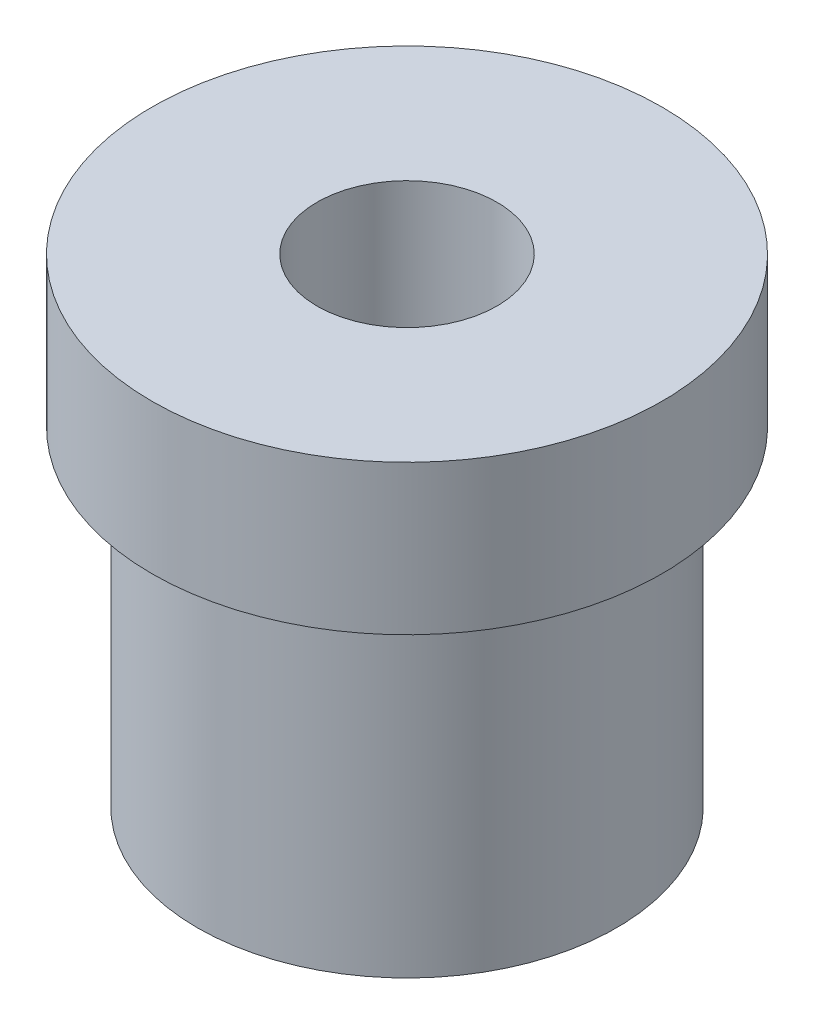
ISO-10303-21;
HEADER;
FILE_DESCRIPTION(('STEP AP214'),'2;1');
FILE_NAME('part.step','',(''),(''),'','','');
FILE_SCHEMA(('AUTOMOTIVE_DESIGN { 1 0 10303 214 1 1 1 1 }'));
ENDSEC;
DATA;
#1=APPLICATION_CONTEXT('core data for automotive mechanical design processes');
#2=APPLICATION_PROTOCOL_DEFINITION('international standard','automotive_design',2000,#1);
#3=PRODUCT_CONTEXT('',#1,'mechanical');
#4=PRODUCT('Part','Part','',(#3));
#5=PRODUCT_RELATED_PRODUCT_CATEGORY('part','',(#4));
#6=PRODUCT_DEFINITION_FORMATION('','',#4);
#7=PRODUCT_DEFINITION_CONTEXT('part definition',#1,'design');
#8=PRODUCT_DEFINITION('design','',#6,#7);
#9=PRODUCT_DEFINITION_SHAPE('','',#8);
#10=(LENGTH_UNIT() NAMED_UNIT(*) SI_UNIT(.MILLI.,.METRE.));
#11=(NAMED_UNIT(*) PLANE_ANGLE_UNIT() SI_UNIT($,.RADIAN.));
#12=(NAMED_UNIT(*) SI_UNIT($,.STERADIAN.) SOLID_ANGLE_UNIT());
#13=UNCERTAINTY_MEASURE_WITH_UNIT(LENGTH_MEASURE(1.E-05),#10,'distance_accuracy_value','');
#14=(GEOMETRIC_REPRESENTATION_CONTEXT(3) GLOBAL_UNCERTAINTY_ASSIGNED_CONTEXT((#13)) GLOBAL_UNIT_ASSIGNED_CONTEXT((#10,
#11,#12)) REPRESENTATION_CONTEXT('',''));
#15=CARTESIAN_POINT('',(0.,0.,0.));
#16=DIRECTION('',(0.,0.,1.));
#17=DIRECTION('',(1.,0.,0.));
#18=AXIS2_PLACEMENT_3D('',#15,#16,#17);
#19=CARTESIAN_POINT('',(0.,-12.7,0.));
#20=DIRECTION('',(0.,1.,0.));
#21=DIRECTION('',(0.,0.,1.));
#22=AXIS2_PLACEMENT_3D('',#19,#20,#21);
#23=CYLINDRICAL_SURFACE('',#22,5.55625);
#24=CARTESIAN_POINT('',(0.,-12.7,0.));
#25=DIRECTION('',(0.,1.,0.));
#26=DIRECTION('',(0.,0.,1.));
#27=AXIS2_PLACEMENT_3D('',#24,#25,#26);
#28=CIRCLE('',#27,5.55625);
#29=CARTESIAN_POINT('',(0.,-12.7,5.55625));
#30=VERTEX_POINT('',#29);
#31=EDGE_CURVE('E10',#30,#30,#28,.T.);
#32=ORIENTED_EDGE('',*,*,#31,.T.);
#33=EDGE_LOOP('',(#32));
#34=FACE_BOUND('',#33,.T.);
#35=CARTESIAN_POINT('',(0.,-3.9624,0.));
#36=DIRECTION('',(0.,1.,0.));
#37=DIRECTION('',(0.,0.,1.));
#38=AXIS2_PLACEMENT_3D('',#35,#36,#37);
#39=CIRCLE('',#38,5.55625);
#40=CARTESIAN_POINT('',(0.,-3.9624,5.55625));
#41=VERTEX_POINT('',#40);
#42=EDGE_CURVE('E35',#41,#41,#39,.F.);
#43=ORIENTED_EDGE('',*,*,#42,.T.);
#44=EDGE_LOOP('',(#43));
#45=FACE_BOUND('',#44,.T.);
#46=ADVANCED_FACE('F32',(#34,#45),#23,.T.);
#47=CARTESIAN_POINT('',(0.,-12.7,0.));
#48=DIRECTION('',(0.,1.,0.));
#49=DIRECTION('',(0.,0.,1.));
#50=AXIS2_PLACEMENT_3D('',#47,#48,#49);
#51=PLANE('',#50);
#52=CARTESIAN_POINT('',(0.,-12.7,0.));
#53=DIRECTION('',(0.,1.,0.));
#54=DIRECTION('',(0.,0.,1.));
#55=AXIS2_PLACEMENT_3D('',#52,#53,#54);
#56=CIRCLE('',#55,2.3876);
#57=CARTESIAN_POINT('',(0.,-12.7,2.3876));
#58=VERTEX_POINT('',#57);
#59=EDGE_CURVE('E47',#58,#58,#56,.T.);
#60=ORIENTED_EDGE('',*,*,#59,.T.);
#61=EDGE_LOOP('',(#60));
#62=FACE_BOUND('',#61,.T.);
#63=ORIENTED_EDGE('',*,*,#31,.F.);
#64=EDGE_LOOP('',(#63));
#65=FACE_BOUND('',#64,.T.);
#66=ADVANCED_FACE('F56',(#62,#65),#51,.F.);
#67=CARTESIAN_POINT('',(0.,-3.9624,0.));
#68=DIRECTION('',(0.,1.,0.));
#69=DIRECTION('',(0.,0.,1.));
#70=AXIS2_PLACEMENT_3D('',#67,#68,#69);
#71=CYLINDRICAL_SURFACE('',#70,6.76275);
#72=CARTESIAN_POINT('',(0.,-3.9624,0.));
#73=DIRECTION('',(0.,1.,0.));
#74=DIRECTION('',(0.,0.,1.));
#75=AXIS2_PLACEMENT_3D('',#72,#73,#74);
#76=CIRCLE('',#75,6.76275);
#77=CARTESIAN_POINT('',(0.,-3.9624,6.76275));
#78=VERTEX_POINT('',#77);
#79=EDGE_CURVE('E42',#78,#78,#76,.T.);
#80=ORIENTED_EDGE('',*,*,#79,.T.);
#81=EDGE_LOOP('',(#80));
#82=FACE_BOUND('',#81,.T.);
#83=CARTESIAN_POINT('',(0.,0.,0.));
#84=DIRECTION('',(0.,1.,0.));
#85=DIRECTION('',(0.,0.,1.));
#86=AXIS2_PLACEMENT_3D('',#83,#84,#85);
#87=CIRCLE('',#86,6.76275);
#88=CARTESIAN_POINT('',(0.,0.,6.76275));
#89=VERTEX_POINT('',#88);
#90=EDGE_CURVE('E44',#89,#89,#87,.T.);
#91=ORIENTED_EDGE('',*,*,#90,.F.);
#92=EDGE_LOOP('',(#91));
#93=FACE_BOUND('',#92,.T.);
#94=ADVANCED_FACE('F71',(#82,#93),#71,.T.);
#95=CARTESIAN_POINT('',(0.,-3.9624,0.));
#96=DIRECTION('',(0.,1.,0.));
#97=DIRECTION('',(0.,0.,1.));
#98=AXIS2_PLACEMENT_3D('',#95,#96,#97);
#99=PLANE('',#98);
#100=ORIENTED_EDGE('',*,*,#42,.F.);
#101=EDGE_LOOP('',(#100));
#102=FACE_BOUND('',#101,.T.);
#103=ORIENTED_EDGE('',*,*,#79,.F.);
#104=EDGE_LOOP('',(#103));
#105=FACE_BOUND('',#104,.T.);
#106=ADVANCED_FACE('F68',(#102,#105),#99,.F.);
#107=CARTESIAN_POINT('',(0.,0.,0.));
#108=DIRECTION('',(0.,1.,0.));
#109=DIRECTION('',(0.,0.,1.));
#110=AXIS2_PLACEMENT_3D('',#107,#108,#109);
#111=PLANE('',#110);
#112=CARTESIAN_POINT('',(0.,0.,0.));
#113=DIRECTION('',(0.,1.,0.));
#114=DIRECTION('',(0.,0.,1.));
#115=AXIS2_PLACEMENT_3D('',#112,#113,#114);
#116=CIRCLE('',#115,2.3876);
#117=CARTESIAN_POINT('',(0.,0.,2.3876));
#118=VERTEX_POINT('',#117);
#119=EDGE_CURVE('E50',#118,#118,#116,.T.);
#120=ORIENTED_EDGE('',*,*,#119,.F.);
#121=EDGE_LOOP('',(#120));
#122=FACE_BOUND('',#121,.T.);
#123=ORIENTED_EDGE('',*,*,#90,.T.);
#124=EDGE_LOOP('',(#123));
#125=FACE_BOUND('',#124,.T.);
#126=ADVANCED_FACE('F62',(#122,#125),#111,.T.);
#127=CARTESIAN_POINT('',(0.,-12.7,0.));
#128=DIRECTION('',(0.,1.,0.));
#129=DIRECTION('',(0.,0.,1.));
#130=AXIS2_PLACEMENT_3D('',#127,#128,#129);
#131=CYLINDRICAL_SURFACE('',#130,2.3876);
#132=ORIENTED_EDGE('',*,*,#59,.F.);
#133=EDGE_LOOP('',(#132));
#134=FACE_BOUND('',#133,.T.);
#135=ORIENTED_EDGE('',*,*,#119,.T.);
#136=EDGE_LOOP('',(#135));
#137=FACE_BOUND('',#136,.T.);
#138=ADVANCED_FACE('F59',(#134,#137),#131,.F.);
#139=CLOSED_SHELL('',(#46,#66,#94,#106,#126,#138));
#140=MANIFOLD_SOLID_BREP('B2',#139);
#141=ADVANCED_BREP_SHAPE_REPRESENTATION('',(#18,#140),#14);
#142=SHAPE_DEFINITION_REPRESENTATION(#9,#141);
ENDSEC;
END-ISO-10303-21;
